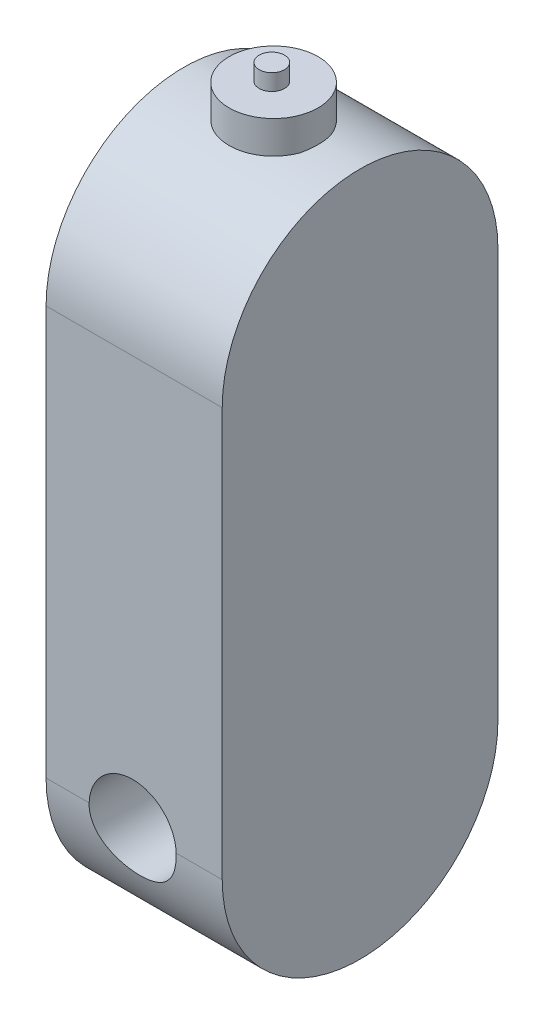
ISO-10303-21;
HEADER;
FILE_DESCRIPTION(('STEP AP214'),'2;1');
FILE_NAME('part.step','',(''),(''),'','','');
FILE_SCHEMA(('AUTOMOTIVE_DESIGN { 1 0 10303 214 1 1 1 1 }'));
ENDSEC;
DATA;
#1=APPLICATION_CONTEXT('core data for automotive mechanical design processes');
#2=APPLICATION_PROTOCOL_DEFINITION('international standard','automotive_design',2000,#1);
#3=PRODUCT_CONTEXT('',#1,'mechanical');
#4=PRODUCT('Part','Part','',(#3));
#5=PRODUCT_RELATED_PRODUCT_CATEGORY('part','',(#4));
#6=PRODUCT_DEFINITION_FORMATION('','',#4);
#7=PRODUCT_DEFINITION_CONTEXT('part definition',#1,'design');
#8=PRODUCT_DEFINITION('design','',#6,#7);
#9=PRODUCT_DEFINITION_SHAPE('','',#8);
#10=(LENGTH_UNIT() NAMED_UNIT(*) SI_UNIT(.MILLI.,.METRE.));
#11=(NAMED_UNIT(*) PLANE_ANGLE_UNIT() SI_UNIT($,.RADIAN.));
#12=(NAMED_UNIT(*) SI_UNIT($,.STERADIAN.) SOLID_ANGLE_UNIT());
#13=UNCERTAINTY_MEASURE_WITH_UNIT(LENGTH_MEASURE(1.E-05),#10,'distance_accuracy_value','');
#14=(GEOMETRIC_REPRESENTATION_CONTEXT(3) GLOBAL_UNCERTAINTY_ASSIGNED_CONTEXT((#13)) GLOBAL_UNIT_ASSIGNED_CONTEXT((#10,
#11,#12)) REPRESENTATION_CONTEXT('',''));
#15=CARTESIAN_POINT('',(0.,0.,0.));
#16=DIRECTION('',(0.,0.,1.));
#17=DIRECTION('',(1.,0.,0.));
#18=AXIS2_PLACEMENT_3D('',#15,#16,#17);
#19=CARTESIAN_POINT('',(27.,41.0000591978642,0.));
#20=DIRECTION('',(-1.,0.,0.));
#21=DIRECTION('',(0.,0.,1.));
#22=AXIS2_PLACEMENT_3D('',#19,#20,#21);
#23=CYLINDRICAL_SURFACE('',#22,21.1294731443185);
#24=CARTESIAN_POINT('',(0.,41.0000591978642,0.));
#25=DIRECTION('',(1.,0.,0.));
#26=DIRECTION('',(0.,0.,-1.));
#27=AXIS2_PLACEMENT_3D('',#24,#25,#26);
#28=CIRCLE('',#27,21.1294731443185);
#29=CARTESIAN_POINT('',(0.,41.0000591978642,-21.1294731443185));
#30=VERTEX_POINT('',#29);
#31=CARTESIAN_POINT('',(0.,41.0000591978642,21.1294731443185));
#32=VERTEX_POINT('',#31);
#33=EDGE_CURVE('E164',#30,#32,#28,.T.);
#34=ORIENTED_EDGE('',*,*,#33,.T.);
#35=DIRECTION('',(-1.,0.,0.));
#36=VECTOR('',#35,1.);
#37=CARTESIAN_POINT('',(27.,41.0000591978642,21.1294731443185));
#38=LINE('',#37,#36);
#39=CARTESIAN_POINT('',(27.,41.0000591978642,21.1294731443185));
#40=VERTEX_POINT('',#39);
#41=EDGE_CURVE('E171',#40,#32,#38,.T.);
#42=ORIENTED_EDGE('',*,*,#41,.F.);
#43=CARTESIAN_POINT('',(27.,41.0000591978642,0.));
#44=DIRECTION('',(1.,0.,0.));
#45=DIRECTION('',(0.,0.,-1.));
#46=AXIS2_PLACEMENT_3D('',#43,#44,#45);
#47=CIRCLE('',#46,21.1294731443185);
#48=CARTESIAN_POINT('',(27.,41.0000591978642,-21.1294731443185));
#49=VERTEX_POINT('',#48);
#50=EDGE_CURVE('E155',#49,#40,#47,.T.);
#51=ORIENTED_EDGE('',*,*,#50,.F.);
#52=DIRECTION('',(-1.,0.,0.));
#53=VECTOR('',#52,1.);
#54=CARTESIAN_POINT('',(27.,41.0000591978642,-21.1294731443185));
#55=LINE('',#54,#53);
#56=EDGE_CURVE('E174',#49,#30,#55,.T.);
#57=ORIENTED_EDGE('',*,*,#56,.T.);
#58=EDGE_LOOP('',(#34,#42,#51,#57));
#59=FACE_BOUND('',#58,.T.);
#60=DIRECTION('',(-1.,0.,0.));
#61=VECTOR('',#60,1.);
#62=CARTESIAN_POINT('',(27.,62.,-2.33604830071399));
#63=LINE('',#62,#61);
#64=CARTESIAN_POINT('',(20.1518883361345,62.,-2.33604830071399));
#65=VERTEX_POINT('',#64);
#66=CARTESIAN_POINT('',(7.34221870234397,62.,-2.33604830071399));
#67=VERTEX_POINT('',#66);
#68=EDGE_CURVE('E41',#65,#67,#63,.T.);
#69=ORIENTED_EDGE('',*,*,#68,.F.);
#70=CARTESIAN_POINT('',(20.1518883361345,62.,2.33604830071399));
#71=CARTESIAN_POINT('',(20.2145336848031,62.0191190733433,2.16435292730299));
#72=CARTESIAN_POINT('',(20.2703059660716,62.0363713739779,1.98993116153583));
#73=CARTESIAN_POINT('',(20.3677286916509,62.0667784075689,1.63681524551681));
#74=CARTESIAN_POINT('',(20.4093772839943,62.0799326031433,1.45812053826199));
#75=CARTESIAN_POINT('',(20.4781949784994,62.1017852101631,1.09750309297684));
#76=CARTESIAN_POINT('',(20.5053494407884,62.1104791161266,0.915577282217817));
#77=CARTESIAN_POINT('',(20.5448727393429,62.1231647822434,0.549982354172503));
#78=CARTESIAN_POINT('',(20.557243151491,62.1271570435604,0.366313424795248));
#79=CARTESIAN_POINT('',(20.5670943082539,62.1303346731511,-0.00170198231362565));
#80=CARTESIAN_POINT('',(20.5645558552513,62.1295138437807,-0.186049028020147));
#81=CARTESIAN_POINT('',(20.5445676518635,62.1230730252482,-0.553849166806813));
#82=CARTESIAN_POINT('',(20.5271179488837,62.1174530513434,-0.737302262727112));
#83=CARTESIAN_POINT('',(20.4775291286834,62.101584218588,-1.10156445037142));
#84=CARTESIAN_POINT('',(20.4454241467431,62.0913461169976,-1.2823786841437));
#85=CARTESIAN_POINT('',(20.3668322008515,62.0665179450597,-1.64046612644147));
#86=CARTESIAN_POINT('',(20.3203536968378,62.0519304348587,-1.81774135278131));
#87=CARTESIAN_POINT('',(20.2492381529776,62.0298887855607,-2.05043509299007));
#88=CARTESIAN_POINT('',(20.2308117229642,62.0241975402159,-2.10797541687914));
#89=CARTESIAN_POINT('',(20.1924674180966,62.0124039375722,-2.2224554542951));
#90=CARTESIAN_POINT('',(20.1725509212692,62.0063019606328,-2.27939566853314));
#91=CARTESIAN_POINT('',(20.1518883361345,62.,-2.33604830071399));
#92=B_SPLINE_CURVE_WITH_KNOTS('',3,(#70,#71,#72,#73,#74,#75,#76,#77,#78,#79,#80,#81,#82,#83,#84,
#85,#86,#87,#88,#89,#90,#91),.UNSPECIFIED.,.F.,.F.,(4,2,2,2,2,2,2,2,2,2,4),(0.,
0.551151578139557,1.10237539806066,1.65415493596222,2.20587565254553,2.75830695596999,
3.3107365031285,3.86188583805809,4.4127113940847,4.59475380461154,4.77662989369266),.UNSPECIFIED.);
#93=CARTESIAN_POINT('',(20.1518883361345,62.,2.33604830071399));
#94=VERTEX_POINT('',#93);
#95=EDGE_CURVE('E97',#94,#65,#92,.T.);
#96=ORIENTED_EDGE('',*,*,#95,.F.);
#97=DIRECTION('',(-1.,0.,0.));
#98=VECTOR('',#97,1.);
#99=CARTESIAN_POINT('',(27.,62.,2.33604830071399));
#100=LINE('',#99,#98);
#101=CARTESIAN_POINT('',(7.34221870234397,62.,2.33604830071399));
#102=VERTEX_POINT('',#101);
#103=EDGE_CURVE('E99',#102,#94,#100,.F.);
#104=ORIENTED_EDGE('',*,*,#103,.F.);
#105=CARTESIAN_POINT('',(7.34221870234397,62.,-2.33604830071399));
#106=CARTESIAN_POINT('',(7.27957335367534,62.0191190733433,-2.16435292730299));
#107=CARTESIAN_POINT('',(7.22380107240684,62.0363713739779,-1.98993116153583));
#108=CARTESIAN_POINT('',(7.12637834682754,62.0667784075689,-1.63681524551681));
#109=CARTESIAN_POINT('',(7.08472975448416,62.0799326031433,-1.45812053826199));
#110=CARTESIAN_POINT('',(7.01591205997902,62.1017852101631,-1.09750309297684));
#111=CARTESIAN_POINT('',(6.98875759769008,62.1104791161266,-0.915577282217816));
#112=CARTESIAN_POINT('',(6.94923429913555,62.1231647822434,-0.549982354172503));
#113=CARTESIAN_POINT('',(6.93686388698743,62.1271570435604,-0.366313424795247));
#114=CARTESIAN_POINT('',(6.92701273022457,62.1303346731511,0.00170198231362595));
#115=CARTESIAN_POINT('',(6.92955118322717,62.1295138437807,0.186049028020147));
#116=CARTESIAN_POINT('',(6.94953938661494,62.1230730252482,0.553849166806814));
#117=CARTESIAN_POINT('',(6.96698908959472,62.1174530513434,0.737302262727113));
#118=CARTESIAN_POINT('',(7.016577909795,62.101584218588,1.10156445037142));
#119=CARTESIAN_POINT('',(7.04868289173531,62.0913461169976,1.2823786841437));
#120=CARTESIAN_POINT('',(7.1272748376269,62.0665179450597,1.64046612644147));
#121=CARTESIAN_POINT('',(7.1737533416406,62.0519304348587,1.81774135278131));
#122=CARTESIAN_POINT('',(7.2448688855008,62.0298887855607,2.05043509299007));
#123=CARTESIAN_POINT('',(7.26329531551423,62.0241975402159,2.10797541687914));
#124=CARTESIAN_POINT('',(7.30163962038179,62.0124039375722,2.2224554542951));
#125=CARTESIAN_POINT('',(7.32155611720919,62.0063019606328,2.27939566853314));
#126=CARTESIAN_POINT('',(7.34221870234397,62.,2.33604830071399));
#127=B_SPLINE_CURVE_WITH_KNOTS('',3,(#105,#106,#107,#108,#109,#110,#111,#112,#113,#114,#115,
#116,#117,#118,#119,#120,#121,#122,#123,#124,#125,#126),.UNSPECIFIED.,.F.,.F.,(4,2,2,2,2,2,2,2,
2,2,4),(0.,0.551151578139557,1.10237539806066,1.65415493596222,2.20587565254553,
2.75830695596999,3.31073650312849,3.86188583805809,4.4127113940847,4.59475380461153,
4.77662989369265),.UNSPECIFIED.);
#128=EDGE_CURVE('E57',#67,#102,#127,.T.);
#129=ORIENTED_EDGE('',*,*,#128,.F.);
#130=EDGE_LOOP('',(#69,#96,#104,#129));
#131=FACE_BOUND('',#130,.T.);
#132=ADVANCED_FACE('F36',(#59,#131),#23,.T.);
#133=CARTESIAN_POINT('',(27.,-21.6635502174611,0.));
#134=DIRECTION('',(-1.,0.,0.));
#135=DIRECTION('',(0.,0.,1.));
#136=AXIS2_PLACEMENT_3D('',#133,#134,#135);
#137=CYLINDRICAL_SURFACE('',#136,21.1294731443185);
#138=DIRECTION('',(-1.,0.,0.));
#139=VECTOR('',#138,1.);
#140=CARTESIAN_POINT('',(27.,-21.6635502174611,21.1294731443185));
#141=LINE('',#140,#139);
#142=CARTESIAN_POINT('',(27.,-21.6635502174611,21.1294731443185));
#143=VERTEX_POINT('',#142);
#144=CARTESIAN_POINT('',(19.9445076927898,-21.6635502174611,21.1294731443185));
#145=VERTEX_POINT('',#144);
#146=EDGE_CURVE('E168',#143,#145,#141,.T.);
#147=ORIENTED_EDGE('',*,*,#146,.T.);
#148=CARTESIAN_POINT('',(19.9445076927898,-21.6635502174611,21.1294731443185));
#149=CARTESIAN_POINT('',(19.9504109830647,-21.846119579052,21.1294963749445));
#150=CARTESIAN_POINT('',(19.9487711549775,-22.0289238664965,21.1271077596053));
#151=CARTESIAN_POINT('',(19.9305441529055,-22.3936278279791,21.1176378080062));
#152=CARTESIAN_POINT('',(19.9139600082487,-22.5755276778398,21.110557422881));
#153=CARTESIAN_POINT('',(19.8660466834828,-22.9366625660007,21.0918586666313));
#154=CARTESIAN_POINT('',(19.8347551931999,-23.1159032146749,21.0802519079047));
#155=CARTESIAN_POINT('',(19.7577410430844,-23.4709242883555,21.0527840718044));
#156=CARTESIAN_POINT('',(19.71201810622,-23.6467046468679,21.0369229127624));
#157=CARTESIAN_POINT('',(19.6065687197314,-23.9935119960382,21.0013402530874));
#158=CARTESIAN_POINT('',(19.5468491898108,-24.1645412889673,20.9816206607985));
#159=CARTESIAN_POINT('',(19.4138640305865,-24.5008800209743,20.9387904973407));
#160=CARTESIAN_POINT('',(19.3405933644933,-24.6661873060415,20.9156786659799));
#161=CARTESIAN_POINT('',(19.1810836469172,-24.9899844179962,20.8666309643331));
#162=CARTESIAN_POINT('',(19.0948443480894,-25.1484741147806,20.8406950401871));
#163=CARTESIAN_POINT('',(18.9099818546943,-25.4577404645128,20.7866161714017));
#164=CARTESIAN_POINT('',(18.8113539672678,-25.6085141639793,20.7584723919406));
#165=CARTESIAN_POINT('',(18.5994939296803,-25.9054777992597,20.6998604953034));
#166=CARTESIAN_POINT('',(18.4859324082351,-26.0514243557925,20.669349545831));
#167=CARTESIAN_POINT('',(18.2471569389321,-26.3333457045326,20.6074861176491));
#168=CARTESIAN_POINT('',(18.121938962779,-26.4693170202028,20.5761333507036));
#169=CARTESIAN_POINT('',(17.8606525922703,-26.730423562648,20.5133971648196));
#170=CARTESIAN_POINT('',(17.7245830616337,-26.855557651773,20.4820137430119));
#171=CARTESIAN_POINT('',(17.4424309543071,-27.0941925203348,20.4200382102814));
#172=CARTESIAN_POINT('',(17.2963483827531,-27.2076933057388,20.3894460989526));
#173=CARTESIAN_POINT('',(16.9905826982478,-27.4254966940384,20.3289881941905));
#174=CARTESIAN_POINT('',(16.8306250634138,-27.529427786466,20.2991706713786));
#175=CARTESIAN_POINT('',(16.5021153392111,-27.7233594615642,20.2421235292678));
#176=CARTESIAN_POINT('',(16.3335664466272,-27.813365176247,20.2148929580173));
#177=CARTESIAN_POINT('',(15.9889161075243,-27.9787804577348,20.163829032819));
#178=CARTESIAN_POINT('',(15.8128134076442,-28.0541875907452,20.1399962455051));
#179=CARTESIAN_POINT('',(15.4543981142864,-28.1896933344717,20.0964961860477));
#180=CARTESIAN_POINT('',(15.2720883377888,-28.2497987873214,20.076827052795));
#181=CARTESIAN_POINT('',(14.9077535602997,-28.3527006001223,20.0427732237274));
#182=CARTESIAN_POINT('',(14.7258653230879,-28.3959370197513,20.0282552259915));
#183=CARTESIAN_POINT('',(14.3588539282707,-28.4670230453558,20.0042196600721));
#184=CARTESIAN_POINT('',(14.1737321474328,-28.4948790427855,19.9947000148652));
#185=CARTESIAN_POINT('',(13.8016178088655,-28.5349483034868,19.980965290651));
#186=CARTESIAN_POINT('',(13.6146253652328,-28.5471625149993,19.9767498900887));
#187=CARTESIAN_POINT('',(13.2402348067898,-28.5558236026501,19.9737634368597));
#188=CARTESIAN_POINT('',(13.0528367049079,-28.5522709740967,19.9749922131666));
#189=CARTESIAN_POINT('',(12.6877672120316,-28.5299666826455,19.9826696596628));
#190=CARTESIAN_POINT('',(12.5100467596402,-28.5119254574654,19.9888743214895));
#191=CARTESIAN_POINT('',(12.1567862076137,-28.4616982376313,20.0060121559297));
#192=CARTESIAN_POINT('',(11.9812468641387,-28.4295074708815,20.0169469238061));
#193=CARTESIAN_POINT('',(11.633681798544,-28.3512840836859,20.0432170384843));
#194=CARTESIAN_POINT('',(11.4616549387545,-28.3052560235048,20.0585509354184));
#195=CARTESIAN_POINT('',(11.1221271471997,-28.199728926083,20.0931850313709));
#196=CARTESIAN_POINT('',(10.9546279559603,-28.140224788542,20.1124867318306));
#197=CARTESIAN_POINT('',(10.6238218904092,-28.007649064716,20.154699793834));
#198=CARTESIAN_POINT('',(10.4605650463637,-27.9344624007047,20.1776415019789));
#199=CARTESIAN_POINT('',(10.1407356751303,-27.7754001795963,20.226389770638));
#200=CARTESIAN_POINT('',(9.98416545018178,-27.6895202968367,20.2521973070359));
#201=CARTESIAN_POINT('',(9.67866669963781,-27.5056828111783,20.3059915137481));
#202=CARTESIAN_POINT('',(9.52973868442661,-27.407724403099,20.3339783292919));
#203=CARTESIAN_POINT('',(9.24036997645231,-27.2003663071708,20.3914166944033));
#204=CARTESIAN_POINT('',(9.09992960758282,-27.0909661831337,20.42086829979));
#205=CARTESIAN_POINT('',(8.82153243844729,-26.855650839424,20.4819976572408));
#206=CARTESIAN_POINT('',(8.6840500087858,-26.7291836722926,20.5137131270887));
#207=CARTESIAN_POINT('',(8.42020049116786,-26.4652158656233,20.5771003212144));
#208=CARTESIAN_POINT('',(8.29382998479796,-26.3277186443806,20.6087720559745));
#209=CARTESIAN_POINT('',(8.05289568477135,-26.0424265752041,20.6712701253685));
#210=CARTESIAN_POINT('',(7.93833839028893,-25.8946261329829,20.7020959878643));
#211=CARTESIAN_POINT('',(7.72192545463448,-25.5897658704882,20.7620708999216));
#212=CARTESIAN_POINT('',(7.62006497355271,-25.4327096122787,20.7912205861296));
#213=CARTESIAN_POINT('',(7.42804933002404,-25.1074232914545,20.8475919820321));
#214=CARTESIAN_POINT('',(7.33813229122354,-24.9390450139696,20.8747706221711));
#215=CARTESIAN_POINT('',(7.17291882669544,-24.5948684016012,20.9258754739699));
#216=CARTESIAN_POINT('',(7.09761667095575,-24.4190730077674,20.9498029591919));
#217=CARTESIAN_POINT('',(6.96228515100352,-24.0613351222723,20.9937538911609));
#218=CARTESIAN_POINT('',(6.90224659285364,-23.8793964061847,21.0137796863611));
#219=CARTESIAN_POINT('',(6.79796263556479,-23.5107066492597,21.0493936498754));
#220=CARTESIAN_POINT('',(6.75371254360457,-23.3239570560886,21.0649831365186));
#221=CARTESIAN_POINT('',(6.6711932982602,-22.8935685517655,21.0950308277621));
#222=CARTESIAN_POINT('',(6.63815653429288,-22.6487800065226,21.1079216684529));
#223=CARTESIAN_POINT('',(6.60907839935537,-22.2800011200177,21.1208383377974));
#224=CARTESIAN_POINT('',(6.60279775633698,-22.1568328704656,21.1240739568025));
#225=CARTESIAN_POINT('',(6.59706457130705,-21.9102673961211,21.1283927366278));
#226=CARTESIAN_POINT('',(6.59761383086293,-21.7868701194994,21.129475329443));
#227=CARTESIAN_POINT('',(6.6015841911598,-21.6635502174611,21.1294731443185));
#228=B_SPLINE_CURVE_WITH_KNOTS('',3,(#148,#149,#150,#151,#152,#153,#154,#155,#156,#157,#158,
#159,#160,#161,#162,#163,#164,#165,#166,#167,#168,#169,#170,#171,#172,#173,#174,#175,#176,#177,
#178,#179,#180,#181,#182,#183,#184,#185,#186,#187,#188,#189,#190,#191,#192,#193,#194,#195,#196,
#197,#198,#199,#200,#201,#202,#203,#204,#205,#206,#207,#208,#209,#210,#211,#212,#213,#214,#215,
#216,#217,#218,#219,#220,#221,#222,#223,#224,#225,#226,#227),.UNSPECIFIED.,.F.,.F.,(4,2,2,2,2,2,
2,2,2,2,2,2,2,2,2,2,2,2,2,2,2,2,2,2,2,2,2,2,2,2,2,2,2,2,2,2,2,2,2,4),(0.,0.547811612998643,
1.09551220534212,1.64181682052763,2.18813192343358,2.73417750404087,3.28042645241254,
3.82668582047445,4.37315274189415,4.93478727060031,5.49661661744379,6.05850487163933,
6.62039283762018,7.19890560616336,7.7772046610667,8.35560004391096,8.93373634166917,
9.49557993108366,10.0571898659554,10.6187657531365,11.1803239987822,11.7159144038179,
12.2516855816546,12.7872803821617,13.3230782293631,13.8636036026863,14.4043136056545,
14.9450596730196,15.4858263625628,16.053601639361,16.6212016331754,17.1891122510753,
17.7568057202513,18.3345112962092,18.9119899133353,19.4891198610805,20.0660781247444,
20.8062381704873,21.1761746377977,21.5462086877036),.UNSPECIFIED.);
#229=CARTESIAN_POINT('',(6.6015841911598,-21.6635502174611,21.1294731443185));
#230=VERTEX_POINT('',#229);
#231=EDGE_CURVE('E119',#145,#230,#228,.T.);
#232=ORIENTED_EDGE('',*,*,#231,.T.);
#233=CARTESIAN_POINT('',(0.,-21.6635502174611,21.1294731443185));
#234=VERTEX_POINT('',#233);
#235=EDGE_CURVE('E159',#230,#234,#141,.T.);
#236=ORIENTED_EDGE('',*,*,#235,.T.);
#237=CARTESIAN_POINT('',(0.,-21.6635502174611,0.));
#238=DIRECTION('',(1.,0.,0.));
#239=DIRECTION('',(0.,0.,-1.));
#240=AXIS2_PLACEMENT_3D('',#237,#238,#239);
#241=CIRCLE('',#240,21.1294731443185);
#242=CARTESIAN_POINT('',(0.,-21.6635502174611,-21.1294731443185));
#243=VERTEX_POINT('',#242);
#244=EDGE_CURVE('E148',#234,#243,#241,.T.);
#245=ORIENTED_EDGE('',*,*,#244,.T.);
#246=DIRECTION('',(-1.,0.,0.));
#247=VECTOR('',#246,1.);
#248=CARTESIAN_POINT('',(27.,-21.6635502174611,-21.1294731443185));
#249=LINE('',#248,#247);
#250=CARTESIAN_POINT('',(6.6015841911598,-21.6635502174611,-21.1294731443185));
#251=VERTEX_POINT('',#250);
#252=EDGE_CURVE('E177',#251,#243,#249,.T.);
#253=ORIENTED_EDGE('',*,*,#252,.F.);
#254=CARTESIAN_POINT('',(6.6015841911598,-21.6635502174611,-21.1294731443185));
#255=CARTESIAN_POINT('',(6.59568090088485,-21.846119579052,-21.1294963749445));
#256=CARTESIAN_POINT('',(6.59732072897206,-22.0289238664965,-21.1271077596053));
#257=CARTESIAN_POINT('',(6.61554773104407,-22.3936278279791,-21.1176378080062));
#258=CARTESIAN_POINT('',(6.63213187570093,-22.5755276778398,-21.110557422881));
#259=CARTESIAN_POINT('',(6.6800452004668,-22.9366625660007,-21.0918586666313));
#260=CARTESIAN_POINT('',(6.71133669074971,-23.1159032146749,-21.0802519079047));
#261=CARTESIAN_POINT('',(6.78835084086518,-23.4709242883555,-21.0527840718044));
#262=CARTESIAN_POINT('',(6.83407377772957,-23.6467046468679,-21.0369229127624));
#263=CARTESIAN_POINT('',(6.93952316421819,-23.9935119960382,-21.0013402530874));
#264=CARTESIAN_POINT('',(6.99924269413875,-24.1645412889673,-20.9816206607985));
#265=CARTESIAN_POINT('',(7.13222785336302,-24.5008800209743,-20.9387904973407));
#266=CARTESIAN_POINT('',(7.20549851945631,-24.6661873060415,-20.9156786659799));
#267=CARTESIAN_POINT('',(7.36500823703233,-24.9899844179962,-20.8666309643331));
#268=CARTESIAN_POINT('',(7.45124753586015,-25.1484741147807,-20.8406950401871));
#269=CARTESIAN_POINT('',(7.6361100292553,-25.4577404645128,-20.7866161714017));
#270=CARTESIAN_POINT('',(7.73473791668173,-25.6085141639793,-20.7584723919406));
#271=CARTESIAN_POINT('',(7.94659795426923,-25.9054777992597,-20.6998604953034));
#272=CARTESIAN_POINT('',(8.06015947571444,-26.0514243557925,-20.669349545831));
#273=CARTESIAN_POINT('',(8.29893494501746,-26.3333457045326,-20.6074861176491));
#274=CARTESIAN_POINT('',(8.42415292117062,-26.4693170202028,-20.5761333507036));
#275=CARTESIAN_POINT('',(8.68543929167932,-26.730423562648,-20.5133971648196));
#276=CARTESIAN_POINT('',(8.82150882231586,-26.855557651773,-20.4820137430119));
#277=CARTESIAN_POINT('',(9.10366092964249,-27.0941925203348,-20.4200382102814));
#278=CARTESIAN_POINT('',(9.24974350119645,-27.2076933057388,-20.3894460989526));
#279=CARTESIAN_POINT('',(9.55550918570177,-27.4254966940384,-20.3289881941905));
#280=CARTESIAN_POINT('',(9.71546682053578,-27.529427786466,-20.2991706713786));
#281=CARTESIAN_POINT('',(10.0439765447385,-27.7233594615642,-20.2421235292678));
#282=CARTESIAN_POINT('',(10.2125254373224,-27.813365176247,-20.2148929580173));
#283=CARTESIAN_POINT('',(10.5571757764253,-27.9787804577348,-20.163829032819));
#284=CARTESIAN_POINT('',(10.7332784763054,-28.0541875907452,-20.1399962455051));
#285=CARTESIAN_POINT('',(11.0916937696632,-28.1896933344717,-20.0964961860477));
#286=CARTESIAN_POINT('',(11.2740035461608,-28.2497987873214,-20.076827052795));
#287=CARTESIAN_POINT('',(11.6383383236498,-28.3527006001223,-20.0427732237274));
#288=CARTESIAN_POINT('',(11.8202265608617,-28.3959370197513,-20.0282552259915));
#289=CARTESIAN_POINT('',(12.1872379556789,-28.4670230453558,-20.0042196600721));
#290=CARTESIAN_POINT('',(12.3723597365168,-28.4948790427855,-19.9947000148652));
#291=CARTESIAN_POINT('',(12.744474075084,-28.5349483034868,-19.980965290651));
#292=CARTESIAN_POINT('',(12.9314665187168,-28.5471625149993,-19.9767498900887));
#293=CARTESIAN_POINT('',(13.3058570771598,-28.5558236026501,-19.9737634368597));
#294=CARTESIAN_POINT('',(13.4932551790417,-28.5522709740967,-19.9749922131666));
#295=CARTESIAN_POINT('',(13.8583246719179,-28.5299666826455,-19.9826696596628));
#296=CARTESIAN_POINT('',(14.0360451243094,-28.5119254574654,-19.9888743214895));
#297=CARTESIAN_POINT('',(14.3893056763359,-28.4616982376313,-20.0060121559297));
#298=CARTESIAN_POINT('',(14.5648450198109,-28.4295074708814,-20.0169469238061));
#299=CARTESIAN_POINT('',(14.9124100854056,-28.3512840836859,-20.0432170384843));
#300=CARTESIAN_POINT('',(15.0844369451951,-28.3052560235048,-20.0585509354184));
#301=CARTESIAN_POINT('',(15.4239647367499,-28.199728926083,-20.0931850313709));
#302=CARTESIAN_POINT('',(15.5914639279893,-28.140224788542,-20.1124867318306));
#303=CARTESIAN_POINT('',(15.9222699935403,-28.007649064716,-20.154699793834));
#304=CARTESIAN_POINT('',(16.0855268375859,-27.9344624007047,-20.1776415019789));
#305=CARTESIAN_POINT('',(16.4053562088193,-27.7754001795963,-20.226389770638));
#306=CARTESIAN_POINT('',(16.5619264337678,-27.6895202968367,-20.2521973070359));
#307=CARTESIAN_POINT('',(16.8674251843118,-27.5056828111783,-20.3059915137481));
#308=CARTESIAN_POINT('',(17.016353199523,-27.407724403099,-20.3339783292919));
#309=CARTESIAN_POINT('',(17.3057219074973,-27.2003663071708,-20.3914166944033));
#310=CARTESIAN_POINT('',(17.4461622763668,-27.0909661831337,-20.42086829979));
#311=CARTESIAN_POINT('',(17.7245594455023,-26.855650839424,-20.4819976572408));
#312=CARTESIAN_POINT('',(17.8620418751638,-26.7291836722926,-20.5137131270887));
#313=CARTESIAN_POINT('',(18.1258913927817,-26.4652158656233,-20.5771003212144));
#314=CARTESIAN_POINT('',(18.2522618991516,-26.3277186443806,-20.6087720559745));
#315=CARTESIAN_POINT('',(18.4931961991782,-26.0424265752041,-20.6712701253685));
#316=CARTESIAN_POINT('',(18.6077534936606,-25.8946261329829,-20.7020959878643));
#317=CARTESIAN_POINT('',(18.8241664293151,-25.5897658704882,-20.7620708999216));
#318=CARTESIAN_POINT('',(18.9260269103969,-25.4327096122787,-20.7912205861296));
#319=CARTESIAN_POINT('',(19.1180425539255,-25.1074232914545,-20.8475919820321));
#320=CARTESIAN_POINT('',(19.207959592726,-24.9390450139696,-20.8747706221711));
#321=CARTESIAN_POINT('',(19.3731730572541,-24.5948684016012,-20.9258754739699));
#322=CARTESIAN_POINT('',(19.4484752129938,-24.4190730077674,-20.9498029591919));
#323=CARTESIAN_POINT('',(19.5838067329461,-24.0613351222723,-20.9937538911609));
#324=CARTESIAN_POINT('',(19.6438452910959,-23.8793964061847,-21.0137796863611));
#325=CARTESIAN_POINT('',(19.7481292483848,-23.5107066492597,-21.0493936498754));
#326=CARTESIAN_POINT('',(19.792379340345,-23.3239570560886,-21.0649831365186));
#327=CARTESIAN_POINT('',(19.8748985856894,-22.8935685517654,-21.0950308277621));
#328=CARTESIAN_POINT('',(19.9079353496567,-22.6487800065226,-21.1079216684529));
#329=CARTESIAN_POINT('',(19.9370134845942,-22.2800011200177,-21.1208383377974));
#330=CARTESIAN_POINT('',(19.9432941276126,-22.1568328704655,-21.1240739568025));
#331=CARTESIAN_POINT('',(19.9490273126425,-21.9102673961211,-21.1283927366278));
#332=CARTESIAN_POINT('',(19.9484780530866,-21.7868701194994,-21.129475329443));
#333=CARTESIAN_POINT('',(19.9445076927898,-21.6635502174611,-21.1294731443185));
#334=B_SPLINE_CURVE_WITH_KNOTS('',3,(#254,#255,#256,#257,#258,#259,#260,#261,#262,#263,#264,
#265,#266,#267,#268,#269,#270,#271,#272,#273,#274,#275,#276,#277,#278,#279,#280,#281,#282,#283,
#284,#285,#286,#287,#288,#289,#290,#291,#292,#293,#294,#295,#296,#297,#298,#299,#300,#301,#302,
#303,#304,#305,#306,#307,#308,#309,#310,#311,#312,#313,#314,#315,#316,#317,#318,#319,#320,#321,
#322,#323,#324,#325,#326,#327,#328,#329,#330,#331,#332,#333),.UNSPECIFIED.,.F.,.F.,(4,2,2,2,2,2,
2,2,2,2,2,2,2,2,2,2,2,2,2,2,2,2,2,2,2,2,2,2,2,2,2,2,2,2,2,2,2,2,2,4),(0.,0.547811612998643,
1.09551220534212,1.64181682052763,2.18813192343359,2.73417750404087,3.28042645241254,
3.82668582047445,4.37315274189415,4.93478727060031,5.4966166174438,6.05850487163934,
6.62039283762019,7.19890560616337,7.7772046610667,8.35560004391096,8.93373634166918,
9.49557993108366,10.0571898659554,10.6187657531365,11.1803239987822,11.715914403818,
12.2516855816547,12.7872803821617,13.3230782293631,13.8636036026863,14.4043136056545,
14.9450596730196,15.4858263625628,16.053601639361,16.6212016331754,17.1891122510753,
17.7568057202513,18.3345112962092,18.9119899133353,19.4891198610805,20.0660781247444,
20.8062381704873,21.1761746377977,21.5462086877036),.UNSPECIFIED.);
#335=CARTESIAN_POINT('',(19.9445076927898,-21.6635502174611,-21.1294731443185));
#336=VERTEX_POINT('',#335);
#337=EDGE_CURVE('E141',#251,#336,#334,.T.);
#338=ORIENTED_EDGE('',*,*,#337,.T.);
#339=CARTESIAN_POINT('',(27.,-21.6635502174611,-21.1294731443185));
#340=VERTEX_POINT('',#339);
#341=EDGE_CURVE('E178',#340,#336,#249,.T.);
#342=ORIENTED_EDGE('',*,*,#341,.F.);
#343=CARTESIAN_POINT('',(27.,-21.6635502174611,0.));
#344=DIRECTION('',(1.,0.,0.));
#345=DIRECTION('',(0.,0.,-1.));
#346=AXIS2_PLACEMENT_3D('',#343,#344,#345);
#347=CIRCLE('',#346,21.1294731443185);
#348=EDGE_CURVE('E149',#143,#340,#347,.T.);
#349=ORIENTED_EDGE('',*,*,#348,.F.);
#350=EDGE_LOOP('',(#147,#232,#236,#245,#253,#338,#342,#349));
#351=FACE_BOUND('',#350,.T.);
#352=ADVANCED_FACE('F38',(#351),#137,.T.);
#353=CARTESIAN_POINT('',(27.,-21.6635502174611,-21.1294731443185));
#354=DIRECTION('',(0.,0.,1.));
#355=DIRECTION('',(1.,0.,0.));
#356=AXIS2_PLACEMENT_3D('',#353,#354,#355);
#357=PLANE('',#356);
#358=ORIENTED_EDGE('',*,*,#341,.T.);
#359=CARTESIAN_POINT('',(13.2730459419748,-21.8783595753016,-21.1294731443185));
#360=DIRECTION('',(0.,0.,1.));
#361=DIRECTION('',(1.,0.,0.));
#362=AXIS2_PLACEMENT_3D('',#359,#360,#361);
#363=CIRCLE('',#362,6.67491909709797);
#364=EDGE_CURVE('E127',#336,#251,#363,.T.);
#365=ORIENTED_EDGE('',*,*,#364,.T.);
#366=ORIENTED_EDGE('',*,*,#252,.T.);
#367=DIRECTION('',(0.,1.,0.));
#368=VECTOR('',#367,1.);
#369=CARTESIAN_POINT('',(0.,-21.6635502174611,-21.1294731443185));
#370=LINE('',#369,#368);
#371=EDGE_CURVE('E162',#243,#30,#370,.T.);
#372=ORIENTED_EDGE('',*,*,#371,.T.);
#373=ORIENTED_EDGE('',*,*,#56,.F.);
#374=DIRECTION('',(0.,1.,0.));
#375=VECTOR('',#374,1.);
#376=CARTESIAN_POINT('',(27.,-21.6635502174611,-21.1294731443185));
#377=LINE('',#376,#375);
#378=EDGE_CURVE('E152',#340,#49,#377,.T.);
#379=ORIENTED_EDGE('',*,*,#378,.F.);
#380=EDGE_LOOP('',(#358,#365,#366,#372,#373,#379));
#381=FACE_BOUND('',#380,.T.);
#382=ADVANCED_FACE('F197',(#381),#357,.F.);
#383=CARTESIAN_POINT('',(27.,-21.6635502174611,21.1294731443185));
#384=DIRECTION('',(0.,0.,-1.));
#385=DIRECTION('',(-1.,0.,0.));
#386=AXIS2_PLACEMENT_3D('',#383,#384,#385);
#387=PLANE('',#386);
#388=ORIENTED_EDGE('',*,*,#235,.F.);
#389=CARTESIAN_POINT('',(13.2730459419748,-21.8783595753016,21.1294731443185));
#390=DIRECTION('',(0.,0.,-1.));
#391=DIRECTION('',(-1.,0.,0.));
#392=AXIS2_PLACEMENT_3D('',#389,#390,#391);
#393=CIRCLE('',#392,6.67491909709797);
#394=EDGE_CURVE('E108',#230,#145,#393,.T.);
#395=ORIENTED_EDGE('',*,*,#394,.T.);
#396=ORIENTED_EDGE('',*,*,#146,.F.);
#397=DIRECTION('',(0.,-1.,0.));
#398=VECTOR('',#397,1.);
#399=CARTESIAN_POINT('',(27.,-21.6635502174611,21.1294731443185));
#400=LINE('',#399,#398);
#401=EDGE_CURVE('E157',#40,#143,#400,.T.);
#402=ORIENTED_EDGE('',*,*,#401,.F.);
#403=ORIENTED_EDGE('',*,*,#41,.T.);
#404=DIRECTION('',(0.,-1.,0.));
#405=VECTOR('',#404,1.);
#406=CARTESIAN_POINT('',(0.,-21.6635502174611,21.1294731443185));
#407=LINE('',#406,#405);
#408=EDGE_CURVE('E153',#32,#234,#407,.T.);
#409=ORIENTED_EDGE('',*,*,#408,.T.);
#410=EDGE_LOOP('',(#388,#395,#396,#402,#403,#409));
#411=FACE_BOUND('',#410,.T.);
#412=ADVANCED_FACE('F196',(#411),#387,.F.);
#413=CARTESIAN_POINT('',(27.,-21.6635502174611,0.));
#414=DIRECTION('',(1.,0.,0.));
#415=DIRECTION('',(0.,0.,-1.));
#416=AXIS2_PLACEMENT_3D('',#413,#414,#415);
#417=PLANE('',#416);
#418=ORIENTED_EDGE('',*,*,#348,.T.);
#419=ORIENTED_EDGE('',*,*,#378,.T.);
#420=ORIENTED_EDGE('',*,*,#50,.T.);
#421=ORIENTED_EDGE('',*,*,#401,.T.);
#422=EDGE_LOOP('',(#418,#419,#420,#421));
#423=FACE_BOUND('',#422,.T.);
#424=ADVANCED_FACE('F138',(#423),#417,.T.);
#425=CARTESIAN_POINT('',(0.,-21.6635502174611,0.));
#426=DIRECTION('',(1.,0.,0.));
#427=DIRECTION('',(0.,0.,-1.));
#428=AXIS2_PLACEMENT_3D('',#425,#426,#427);
#429=PLANE('',#428);
#430=ORIENTED_EDGE('',*,*,#244,.F.);
#431=ORIENTED_EDGE('',*,*,#408,.F.);
#432=ORIENTED_EDGE('',*,*,#33,.F.);
#433=ORIENTED_EDGE('',*,*,#371,.F.);
#434=EDGE_LOOP('',(#430,#431,#432,#433));
#435=FACE_BOUND('',#434,.T.);
#436=ADVANCED_FACE('F134',(#435),#429,.F.);
#437=CARTESIAN_POINT('',(13.2730459419748,-21.8783595753016,-29.));
#438=DIRECTION('',(0.,0.,1.));
#439=DIRECTION('',(1.,0.,0.));
#440=AXIS2_PLACEMENT_3D('',#437,#438,#439);
#441=CYLINDRICAL_SURFACE('',#440,6.67491909709797);
#442=ORIENTED_EDGE('',*,*,#394,.F.);
#443=ORIENTED_EDGE('',*,*,#231,.F.);
#444=EDGE_LOOP('',(#442,#443));
#445=FACE_BOUND('',#444,.T.);
#446=ORIENTED_EDGE('',*,*,#364,.F.);
#447=ORIENTED_EDGE('',*,*,#337,.F.);
#448=EDGE_LOOP('',(#446,#447));
#449=FACE_BOUND('',#448,.T.);
#450=ADVANCED_FACE('F129',(#445,#449),#441,.F.);
#451=CARTESIAN_POINT('',(13.7470535192392,67.,0.));
#452=DIRECTION('',(0.,-1.,0.));
#453=DIRECTION('',(0.,0.,-1.));
#454=AXIS2_PLACEMENT_3D('',#451,#452,#453);
#455=CYLINDRICAL_SURFACE('',#454,6.81755313107146);
#456=CARTESIAN_POINT('',(13.7470535192392,67.,0.));
#457=DIRECTION('',(0.,1.,0.));
#458=DIRECTION('',(0.,0.,1.));
#459=AXIS2_PLACEMENT_3D('',#456,#457,#458);
#460=CIRCLE('',#459,6.81755313107146);
#461=CARTESIAN_POINT('',(13.7470535192392,67.,6.81755313107146));
#462=VERTEX_POINT('',#461);
#463=EDGE_CURVE('E114',#462,#462,#460,.T.);
#464=ORIENTED_EDGE('',*,*,#463,.F.);
#465=EDGE_LOOP('',(#464));
#466=FACE_BOUND('',#465,.T.);
#467=CARTESIAN_POINT('',(13.7470535192392,62.,0.));
#468=DIRECTION('',(0.,1.,0.));
#469=DIRECTION('',(0.,0.,1.));
#470=AXIS2_PLACEMENT_3D('',#467,#468,#469);
#471=CIRCLE('',#470,6.81755313107146);
#472=EDGE_CURVE('E107',#102,#94,#471,.T.);
#473=ORIENTED_EDGE('',*,*,#472,.T.);
#474=ORIENTED_EDGE('',*,*,#95,.T.);
#475=EDGE_CURVE('E111',#65,#67,#471,.T.);
#476=ORIENTED_EDGE('',*,*,#475,.T.);
#477=ORIENTED_EDGE('',*,*,#128,.T.);
#478=EDGE_LOOP('',(#473,#474,#476,#477));
#479=FACE_BOUND('',#478,.T.);
#480=ADVANCED_FACE('F110',(#466,#479),#455,.T.);
#481=CARTESIAN_POINT('',(13.7470535192392,62.,0.));
#482=DIRECTION('',(0.,1.,0.));
#483=DIRECTION('',(0.,0.,1.));
#484=AXIS2_PLACEMENT_3D('',#481,#482,#483);
#485=PLANE('',#484);
#486=ORIENTED_EDGE('',*,*,#475,.F.);
#487=ORIENTED_EDGE('',*,*,#68,.T.);
#488=EDGE_LOOP('',(#486,#487));
#489=FACE_BOUND('',#488,.T.);
#490=ADVANCED_FACE('F243',(#489),#485,.F.);
#491=ORIENTED_EDGE('',*,*,#472,.F.);
#492=ORIENTED_EDGE('',*,*,#103,.T.);
#493=EDGE_LOOP('',(#491,#492));
#494=FACE_BOUND('',#493,.T.);
#495=ADVANCED_FACE('F106',(#494),#485,.F.);
#496=CARTESIAN_POINT('',(13.7470535192392,67.,0.));
#497=DIRECTION('',(0.,1.,0.));
#498=DIRECTION('',(0.,0.,1.));
#499=AXIS2_PLACEMENT_3D('',#496,#497,#498);
#500=PLANE('',#499);
#501=CARTESIAN_POINT('',(13.4728272782638,67.,0.));
#502=DIRECTION('',(0.,1.,0.));
#503=DIRECTION('',(0.,0.,1.));
#504=AXIS2_PLACEMENT_3D('',#501,#502,#503);
#505=CIRCLE('',#504,1.93691662261147);
#506=CARTESIAN_POINT('',(13.4728272782638,67.,1.93691662261147));
#507=VERTEX_POINT('',#506);
#508=EDGE_CURVE('E11',#507,#507,#505,.T.);
#509=ORIENTED_EDGE('',*,*,#508,.F.);
#510=EDGE_LOOP('',(#509));
#511=FACE_BOUND('',#510,.T.);
#512=ORIENTED_EDGE('',*,*,#463,.T.);
#513=EDGE_LOOP('',(#512));
#514=FACE_BOUND('',#513,.T.);
#515=ADVANCED_FACE('F256',(#511,#514),#500,.T.);
#516=CARTESIAN_POINT('',(13.4728272782638,69.5,0.));
#517=DIRECTION('',(0.,-1.,0.));
#518=DIRECTION('',(0.,0.,-1.));
#519=AXIS2_PLACEMENT_3D('',#516,#517,#518);
#520=CYLINDRICAL_SURFACE('',#519,1.93691662261147);
#521=CARTESIAN_POINT('',(13.4728272782638,69.5,0.));
#522=DIRECTION('',(0.,1.,0.));
#523=DIRECTION('',(0.,0.,1.));
#524=AXIS2_PLACEMENT_3D('',#521,#522,#523);
#525=CIRCLE('',#524,1.93691662261147);
#526=CARTESIAN_POINT('',(13.4728272782638,69.5,1.93691662261147));
#527=VERTEX_POINT('',#526);
#528=EDGE_CURVE('E112',#527,#527,#525,.T.);
#529=ORIENTED_EDGE('',*,*,#528,.F.);
#530=EDGE_LOOP('',(#529));
#531=FACE_BOUND('',#530,.T.);
#532=ORIENTED_EDGE('',*,*,#508,.T.);
#533=EDGE_LOOP('',(#532));
#534=FACE_BOUND('',#533,.T.);
#535=ADVANCED_FACE('F262',(#531,#534),#520,.T.);
#536=CARTESIAN_POINT('',(13.4728272782638,69.5,0.));
#537=DIRECTION('',(0.,1.,0.));
#538=DIRECTION('',(0.,0.,1.));
#539=AXIS2_PLACEMENT_3D('',#536,#537,#538);
#540=PLANE('',#539);
#541=ORIENTED_EDGE('',*,*,#528,.T.);
#542=EDGE_LOOP('',(#541));
#543=FACE_BOUND('',#542,.T.);
#544=ADVANCED_FACE('F270',(#543),#540,.T.);
#545=CLOSED_SHELL('',(#132,#352,#382,#412,#424,#436,#450,#480,#490,#495,#515,#535,#544));
#546=MANIFOLD_SOLID_BREP('B2',#545);
#547=ADVANCED_BREP_SHAPE_REPRESENTATION('',(#18,#546),#14);
#548=SHAPE_DEFINITION_REPRESENTATION(#9,#547);
ENDSEC;
END-ISO-10303-21;
